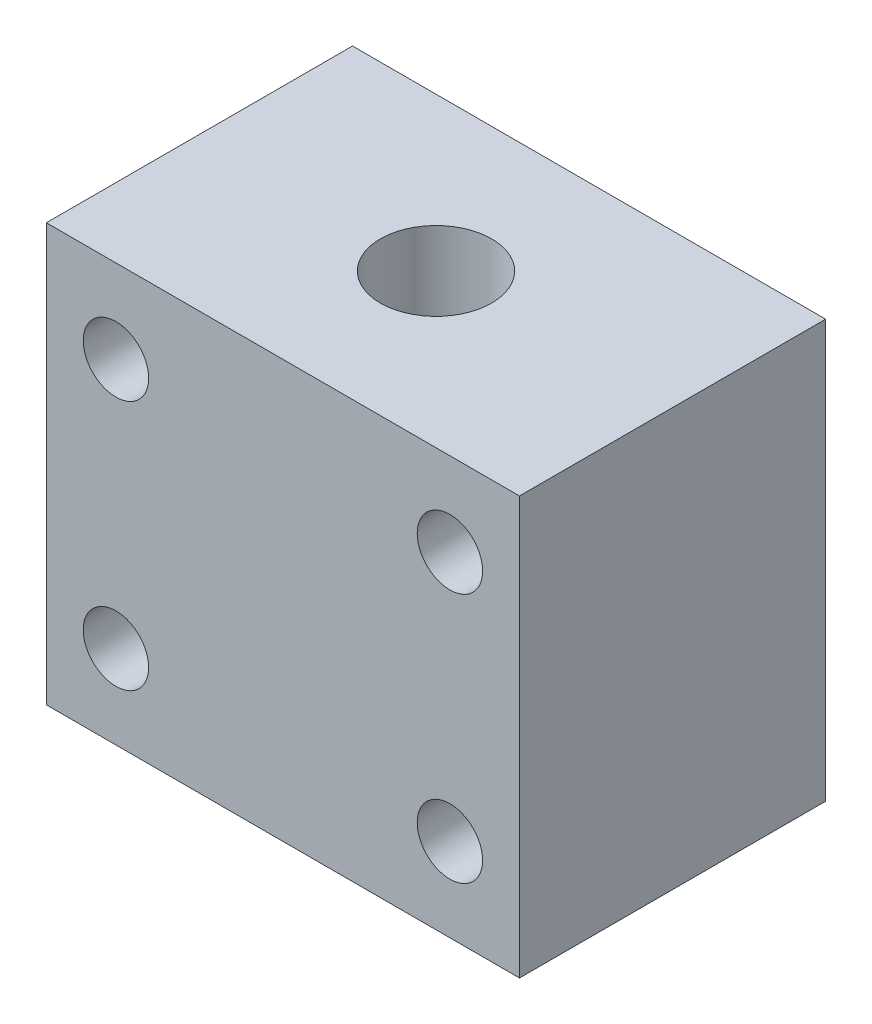
ISO-10303-21;
HEADER;
FILE_DESCRIPTION(('STEP AP214'),'2;1');
FILE_NAME('part.step','',(''),(''),'','','');
FILE_SCHEMA(('AUTOMOTIVE_DESIGN { 1 0 10303 214 1 1 1 1 }'));
ENDSEC;
DATA;
#1=APPLICATION_CONTEXT('core data for automotive mechanical design processes');
#2=APPLICATION_PROTOCOL_DEFINITION('international standard','automotive_design',2000,#1);
#3=PRODUCT_CONTEXT('',#1,'mechanical');
#4=PRODUCT('Part','Part','',(#3));
#5=PRODUCT_RELATED_PRODUCT_CATEGORY('part','',(#4));
#6=PRODUCT_DEFINITION_FORMATION('','',#4);
#7=PRODUCT_DEFINITION_CONTEXT('part definition',#1,'design');
#8=PRODUCT_DEFINITION('design','',#6,#7);
#9=PRODUCT_DEFINITION_SHAPE('','',#8);
#10=(LENGTH_UNIT() NAMED_UNIT(*) SI_UNIT(.MILLI.,.METRE.));
#11=(NAMED_UNIT(*) PLANE_ANGLE_UNIT() SI_UNIT($,.RADIAN.));
#12=(NAMED_UNIT(*) SI_UNIT($,.STERADIAN.) SOLID_ANGLE_UNIT());
#13=UNCERTAINTY_MEASURE_WITH_UNIT(LENGTH_MEASURE(1.E-05),#10,'distance_accuracy_value','');
#14=(GEOMETRIC_REPRESENTATION_CONTEXT(3) GLOBAL_UNCERTAINTY_ASSIGNED_CONTEXT((#13)) GLOBAL_UNIT_ASSIGNED_CONTEXT((#10,
#11,#12)) REPRESENTATION_CONTEXT('',''));
#15=CARTESIAN_POINT('',(0.,0.,0.));
#16=DIRECTION('',(0.,0.,1.));
#17=DIRECTION('',(1.,0.,0.));
#18=AXIS2_PLACEMENT_3D('',#15,#16,#17);
#19=CARTESIAN_POINT('',(0.,30.,0.));
#20=DIRECTION('',(0.,1.,0.));
#21=DIRECTION('',(0.,0.,1.));
#22=AXIS2_PLACEMENT_3D('',#19,#20,#21);
#23=PLANE('',#22);
#24=DIRECTION('',(0.,0.,-1.));
#25=VECTOR('',#24,1.);
#26=CARTESIAN_POINT('',(17.,30.,-11.));
#27=LINE('',#26,#25);
#28=CARTESIAN_POINT('',(17.,30.,11.));
#29=VERTEX_POINT('',#28);
#30=CARTESIAN_POINT('',(17.,30.,-11.));
#31=VERTEX_POINT('',#30);
#32=EDGE_CURVE('E96',#29,#31,#27,.T.);
#33=ORIENTED_EDGE('',*,*,#32,.T.);
#34=DIRECTION('',(-1.,0.,0.));
#35=VECTOR('',#34,1.);
#36=CARTESIAN_POINT('',(-17.,30.,-11.));
#37=LINE('',#36,#35);
#38=CARTESIAN_POINT('',(-17.,30.,-11.));
#39=VERTEX_POINT('',#38);
#40=EDGE_CURVE('E91',#31,#39,#37,.T.);
#41=ORIENTED_EDGE('',*,*,#40,.T.);
#42=DIRECTION('',(0.,0.,1.));
#43=VECTOR('',#42,1.);
#44=CARTESIAN_POINT('',(-17.,30.,-11.));
#45=LINE('',#44,#43);
#46=CARTESIAN_POINT('',(-17.,30.,11.));
#47=VERTEX_POINT('',#46);
#48=EDGE_CURVE('E94',#39,#47,#45,.T.);
#49=ORIENTED_EDGE('',*,*,#48,.T.);
#50=DIRECTION('',(1.,0.,0.));
#51=VECTOR('',#50,1.);
#52=CARTESIAN_POINT('',(-17.,30.,11.));
#53=LINE('',#52,#51);
#54=EDGE_CURVE('E61',#47,#29,#53,.T.);
#55=ORIENTED_EDGE('',*,*,#54,.T.);
#56=EDGE_LOOP('',(#33,#41,#49,#55));
#57=FACE_BOUND('',#56,.T.);
#58=CARTESIAN_POINT('',(0.,30.,0.));
#59=DIRECTION('',(0.,1.,0.));
#60=DIRECTION('',(0.,0.,1.));
#61=AXIS2_PLACEMENT_3D('',#58,#59,#60);
#62=CIRCLE('',#61,4.);
#63=CARTESIAN_POINT('',(0.,30.,3.99999999999997));
#64=VERTEX_POINT('',#63);
#65=EDGE_CURVE('E116',#64,#64,#62,.T.);
#66=ORIENTED_EDGE('',*,*,#65,.F.);
#67=EDGE_LOOP('',(#66));
#68=FACE_BOUND('',#67,.T.);
#69=ADVANCED_FACE('F43',(#57,#68),#23,.T.);
#70=CARTESIAN_POINT('',(0.,0.,0.));
#71=DIRECTION('',(0.,1.,0.));
#72=DIRECTION('',(0.,0.,1.));
#73=AXIS2_PLACEMENT_3D('',#70,#71,#72);
#74=PLANE('',#73);
#75=DIRECTION('',(0.,0.,-1.));
#76=VECTOR('',#75,1.);
#77=CARTESIAN_POINT('',(17.,0.,-11.));
#78=LINE('',#77,#76);
#79=CARTESIAN_POINT('',(17.,0.,11.));
#80=VERTEX_POINT('',#79);
#81=CARTESIAN_POINT('',(17.,0.,-11.));
#82=VERTEX_POINT('',#81);
#83=EDGE_CURVE('E112',#80,#82,#78,.T.);
#84=ORIENTED_EDGE('',*,*,#83,.F.);
#85=DIRECTION('',(1.,0.,0.));
#86=VECTOR('',#85,1.);
#87=CARTESIAN_POINT('',(-17.,0.,11.));
#88=LINE('',#87,#86);
#89=CARTESIAN_POINT('',(-17.,0.,11.));
#90=VERTEX_POINT('',#89);
#91=EDGE_CURVE('E84',#90,#80,#88,.T.);
#92=ORIENTED_EDGE('',*,*,#91,.F.);
#93=DIRECTION('',(0.,0.,1.));
#94=VECTOR('',#93,1.);
#95=CARTESIAN_POINT('',(-17.,0.,-11.));
#96=LINE('',#95,#94);
#97=CARTESIAN_POINT('',(-17.,0.,-11.));
#98=VERTEX_POINT('',#97);
#99=EDGE_CURVE('E78',#98,#90,#96,.T.);
#100=ORIENTED_EDGE('',*,*,#99,.F.);
#101=DIRECTION('',(-1.,0.,0.));
#102=VECTOR('',#101,1.);
#103=CARTESIAN_POINT('',(-17.,0.,-11.));
#104=LINE('',#103,#102);
#105=EDGE_CURVE('E101',#82,#98,#104,.T.);
#106=ORIENTED_EDGE('',*,*,#105,.F.);
#107=EDGE_LOOP('',(#84,#92,#100,#106));
#108=FACE_BOUND('',#107,.T.);
#109=CARTESIAN_POINT('',(0.,0.,0.));
#110=DIRECTION('',(0.,1.,0.));
#111=DIRECTION('',(0.,0.,1.));
#112=AXIS2_PLACEMENT_3D('',#109,#110,#111);
#113=CIRCLE('',#112,4.);
#114=CARTESIAN_POINT('',(0.,0.,3.99999999999997));
#115=VERTEX_POINT('',#114);
#116=EDGE_CURVE('E134',#115,#115,#113,.T.);
#117=ORIENTED_EDGE('',*,*,#116,.T.);
#118=EDGE_LOOP('',(#117));
#119=FACE_BOUND('',#118,.T.);
#120=ADVANCED_FACE('F129',(#108,#119),#74,.F.);
#121=CARTESIAN_POINT('',(17.,30.,-11.));
#122=DIRECTION('',(-1.,0.,0.));
#123=DIRECTION('',(0.,0.,1.));
#124=AXIS2_PLACEMENT_3D('',#121,#122,#123);
#125=PLANE('',#124);
#126=ORIENTED_EDGE('',*,*,#83,.T.);
#127=DIRECTION('',(0.,-1.,0.));
#128=VECTOR('',#127,1.);
#129=CARTESIAN_POINT('',(17.,30.,-11.));
#130=LINE('',#129,#128);
#131=EDGE_CURVE('E11',#31,#82,#130,.T.);
#132=ORIENTED_EDGE('',*,*,#131,.F.);
#133=ORIENTED_EDGE('',*,*,#32,.F.);
#134=DIRECTION('',(0.,-1.,0.));
#135=VECTOR('',#134,1.);
#136=CARTESIAN_POINT('',(17.,30.,11.));
#137=LINE('',#136,#135);
#138=EDGE_CURVE('E108',#29,#80,#137,.T.);
#139=ORIENTED_EDGE('',*,*,#138,.T.);
#140=EDGE_LOOP('',(#126,#132,#133,#139));
#141=FACE_BOUND('',#140,.T.);
#142=ADVANCED_FACE('F45',(#141),#125,.F.);
#143=CARTESIAN_POINT('',(-17.,30.,-11.));
#144=DIRECTION('',(0.,0.,1.));
#145=DIRECTION('',(1.,0.,0.));
#146=AXIS2_PLACEMENT_3D('',#143,#144,#145);
#147=PLANE('',#146);
#148=ORIENTED_EDGE('',*,*,#105,.T.);
#149=DIRECTION('',(0.,-1.,0.));
#150=VECTOR('',#149,1.);
#151=CARTESIAN_POINT('',(-17.,30.,-11.));
#152=LINE('',#151,#150);
#153=EDGE_CURVE('E53',#39,#98,#152,.T.);
#154=ORIENTED_EDGE('',*,*,#153,.F.);
#155=ORIENTED_EDGE('',*,*,#40,.F.);
#156=ORIENTED_EDGE('',*,*,#131,.T.);
#157=EDGE_LOOP('',(#148,#154,#155,#156));
#158=FACE_BOUND('',#157,.T.);
#159=ADVANCED_FACE('F100',(#158),#147,.F.);
#160=CARTESIAN_POINT('',(-17.,30.,-11.));
#161=DIRECTION('',(1.,0.,0.));
#162=DIRECTION('',(0.,0.,-1.));
#163=AXIS2_PLACEMENT_3D('',#160,#161,#162);
#164=PLANE('',#163);
#165=ORIENTED_EDGE('',*,*,#99,.T.);
#166=DIRECTION('',(0.,-1.,0.));
#167=VECTOR('',#166,1.);
#168=CARTESIAN_POINT('',(-17.,30.,11.));
#169=LINE('',#168,#167);
#170=EDGE_CURVE('E103',#47,#90,#169,.T.);
#171=ORIENTED_EDGE('',*,*,#170,.F.);
#172=ORIENTED_EDGE('',*,*,#48,.F.);
#173=ORIENTED_EDGE('',*,*,#153,.T.);
#174=EDGE_LOOP('',(#165,#171,#172,#173));
#175=FACE_BOUND('',#174,.T.);
#176=ADVANCED_FACE('F104',(#175),#164,.F.);
#177=CARTESIAN_POINT('',(-17.,30.,11.));
#178=DIRECTION('',(0.,0.,-1.));
#179=DIRECTION('',(-1.,0.,0.));
#180=AXIS2_PLACEMENT_3D('',#177,#178,#179);
#181=PLANE('',#180);
#182=CARTESIAN_POINT('',(12.,24.,11.));
#183=DIRECTION('',(0.,0.,1.));
#184=DIRECTION('',(-1.,0.,0.));
#185=AXIS2_PLACEMENT_3D('',#182,#183,#184);
#186=CIRCLE('',#185,2.35);
#187=CARTESIAN_POINT('',(9.65000000000001,24.,11.));
#188=VERTEX_POINT('',#187);
#189=EDGE_CURVE('E154',#188,#188,#186,.T.);
#190=ORIENTED_EDGE('',*,*,#189,.F.);
#191=EDGE_LOOP('',(#190));
#192=FACE_BOUND('',#191,.T.);
#193=CARTESIAN_POINT('',(12.,5.99999999999999,11.));
#194=DIRECTION('',(0.,0.,1.));
#195=DIRECTION('',(-1.,0.,0.));
#196=AXIS2_PLACEMENT_3D('',#193,#194,#195);
#197=CIRCLE('',#196,2.35);
#198=CARTESIAN_POINT('',(9.65,5.99999999999999,11.));
#199=VERTEX_POINT('',#198);
#200=EDGE_CURVE('E162',#199,#199,#197,.T.);
#201=ORIENTED_EDGE('',*,*,#200,.F.);
#202=EDGE_LOOP('',(#201));
#203=FACE_BOUND('',#202,.T.);
#204=CARTESIAN_POINT('',(-12.,6.,11.));
#205=DIRECTION('',(0.,0.,1.));
#206=DIRECTION('',(1.,0.,0.));
#207=AXIS2_PLACEMENT_3D('',#204,#205,#206);
#208=CIRCLE('',#207,2.35);
#209=CARTESIAN_POINT('',(-9.65,6.,11.));
#210=VERTEX_POINT('',#209);
#211=EDGE_CURVE('E146',#210,#210,#208,.T.);
#212=ORIENTED_EDGE('',*,*,#211,.F.);
#213=EDGE_LOOP('',(#212));
#214=FACE_BOUND('',#213,.T.);
#215=CARTESIAN_POINT('',(-12.,24.,11.));
#216=DIRECTION('',(0.,0.,1.));
#217=DIRECTION('',(1.,0.,0.));
#218=AXIS2_PLACEMENT_3D('',#215,#216,#217);
#219=CIRCLE('',#218,2.35);
#220=CARTESIAN_POINT('',(-9.65,24.,11.));
#221=VERTEX_POINT('',#220);
#222=EDGE_CURVE('E142',#221,#221,#219,.T.);
#223=ORIENTED_EDGE('',*,*,#222,.F.);
#224=EDGE_LOOP('',(#223));
#225=FACE_BOUND('',#224,.T.);
#226=ORIENTED_EDGE('',*,*,#91,.T.);
#227=ORIENTED_EDGE('',*,*,#138,.F.);
#228=ORIENTED_EDGE('',*,*,#54,.F.);
#229=ORIENTED_EDGE('',*,*,#170,.T.);
#230=EDGE_LOOP('',(#226,#227,#228,#229));
#231=FACE_BOUND('',#230,.T.);
#232=ADVANCED_FACE('F126',(#192,#203,#214,#225,#231),#181,.F.);
#233=CARTESIAN_POINT('',(0.,30.,0.));
#234=DIRECTION('',(0.,-1.,0.));
#235=DIRECTION('',(0.,0.,-1.));
#236=AXIS2_PLACEMENT_3D('',#233,#234,#235);
#237=CYLINDRICAL_SURFACE('',#236,4.);
#238=ORIENTED_EDGE('',*,*,#65,.T.);
#239=EDGE_LOOP('',(#238));
#240=FACE_BOUND('',#239,.T.);
#241=ORIENTED_EDGE('',*,*,#116,.F.);
#242=EDGE_LOOP('',(#241));
#243=FACE_BOUND('',#242,.T.);
#244=ADVANCED_FACE('F178',(#240,#243),#237,.F.);
#245=CARTESIAN_POINT('',(-12.,24.,5.99999999999999));
#246=DIRECTION('',(0.,0.,1.));
#247=DIRECTION('',(1.,0.,0.));
#248=AXIS2_PLACEMENT_3D('',#245,#246,#247);
#249=CYLINDRICAL_SURFACE('',#248,2.35);
#250=CARTESIAN_POINT('',(-12.,24.,5.99999999999999));
#251=DIRECTION('',(0.,0.,1.));
#252=DIRECTION('',(1.,0.,0.));
#253=AXIS2_PLACEMENT_3D('',#250,#251,#252);
#254=CIRCLE('',#253,2.35);
#255=CARTESIAN_POINT('',(-9.65,24.,5.99999999999999));
#256=VERTEX_POINT('',#255);
#257=EDGE_CURVE('E138',#256,#256,#254,.T.);
#258=ORIENTED_EDGE('',*,*,#257,.F.);
#259=EDGE_LOOP('',(#258));
#260=FACE_BOUND('',#259,.T.);
#261=ORIENTED_EDGE('',*,*,#222,.T.);
#262=EDGE_LOOP('',(#261));
#263=FACE_BOUND('',#262,.T.);
#264=ADVANCED_FACE('F183',(#260,#263),#249,.F.);
#265=CARTESIAN_POINT('',(-12.,24.,5.99999999999999));
#266=DIRECTION('',(0.,0.,1.));
#267=DIRECTION('',(1.,0.,0.));
#268=AXIS2_PLACEMENT_3D('',#265,#266,#267);
#269=PLANE('',#268);
#270=ORIENTED_EDGE('',*,*,#257,.T.);
#271=EDGE_LOOP('',(#270));
#272=FACE_BOUND('',#271,.T.);
#273=ADVANCED_FACE('F185',(#272),#269,.T.);
#274=CARTESIAN_POINT('',(-12.,6.,5.99999999999999));
#275=DIRECTION('',(0.,0.,1.));
#276=DIRECTION('',(1.,0.,0.));
#277=AXIS2_PLACEMENT_3D('',#274,#275,#276);
#278=CYLINDRICAL_SURFACE('',#277,2.35);
#279=CARTESIAN_POINT('',(-12.,6.,5.99999999999999));
#280=DIRECTION('',(0.,0.,1.));
#281=DIRECTION('',(1.,0.,0.));
#282=AXIS2_PLACEMENT_3D('',#279,#280,#281);
#283=CIRCLE('',#282,2.35);
#284=CARTESIAN_POINT('',(-9.65,6.,5.99999999999999));
#285=VERTEX_POINT('',#284);
#286=EDGE_CURVE('E166',#285,#285,#283,.T.);
#287=ORIENTED_EDGE('',*,*,#286,.F.);
#288=EDGE_LOOP('',(#287));
#289=FACE_BOUND('',#288,.T.);
#290=ORIENTED_EDGE('',*,*,#211,.T.);
#291=EDGE_LOOP('',(#290));
#292=FACE_BOUND('',#291,.T.);
#293=ADVANCED_FACE('F174',(#289,#292),#278,.F.);
#294=CARTESIAN_POINT('',(-12.,6.,5.99999999999999));
#295=DIRECTION('',(0.,0.,1.));
#296=DIRECTION('',(1.,0.,0.));
#297=AXIS2_PLACEMENT_3D('',#294,#295,#296);
#298=PLANE('',#297);
#299=ORIENTED_EDGE('',*,*,#286,.T.);
#300=EDGE_LOOP('',(#299));
#301=FACE_BOUND('',#300,.T.);
#302=ADVANCED_FACE('F270',(#301),#298,.T.);
#303=CARTESIAN_POINT('',(12.,5.99999999999999,5.99999999999999));
#304=DIRECTION('',(0.,0.,1.));
#305=DIRECTION('',(1.,0.,0.));
#306=AXIS2_PLACEMENT_3D('',#303,#304,#305);
#307=CYLINDRICAL_SURFACE('',#306,2.35);
#308=CARTESIAN_POINT('',(12.,5.99999999999999,5.99999999999999));
#309=DIRECTION('',(0.,0.,1.));
#310=DIRECTION('',(-1.,0.,0.));
#311=AXIS2_PLACEMENT_3D('',#308,#309,#310);
#312=CIRCLE('',#311,2.35);
#313=CARTESIAN_POINT('',(9.65,5.99999999999999,5.99999999999999));
#314=VERTEX_POINT('',#313);
#315=EDGE_CURVE('E158',#314,#314,#312,.T.);
#316=ORIENTED_EDGE('',*,*,#315,.F.);
#317=EDGE_LOOP('',(#316));
#318=FACE_BOUND('',#317,.T.);
#319=ORIENTED_EDGE('',*,*,#200,.T.);
#320=EDGE_LOOP('',(#319));
#321=FACE_BOUND('',#320,.T.);
#322=ADVANCED_FACE('F280',(#318,#321),#307,.F.);
#323=CARTESIAN_POINT('',(12.,5.99999999999999,5.99999999999999));
#324=DIRECTION('',(0.,0.,-1.));
#325=DIRECTION('',(-1.,0.,0.));
#326=AXIS2_PLACEMENT_3D('',#323,#324,#325);
#327=PLANE('',#326);
#328=ORIENTED_EDGE('',*,*,#315,.T.);
#329=EDGE_LOOP('',(#328));
#330=FACE_BOUND('',#329,.T.);
#331=ADVANCED_FACE('F290',(#330),#327,.F.);
#332=CARTESIAN_POINT('',(12.,24.,5.99999999999999));
#333=DIRECTION('',(0.,0.,1.));
#334=DIRECTION('',(1.,0.,0.));
#335=AXIS2_PLACEMENT_3D('',#332,#333,#334);
#336=CYLINDRICAL_SURFACE('',#335,2.35);
#337=CARTESIAN_POINT('',(12.,24.,5.99999999999999));
#338=DIRECTION('',(0.,0.,1.));
#339=DIRECTION('',(-1.,0.,0.));
#340=AXIS2_PLACEMENT_3D('',#337,#338,#339);
#341=CIRCLE('',#340,2.35);
#342=CARTESIAN_POINT('',(9.65000000000001,24.,5.99999999999999));
#343=VERTEX_POINT('',#342);
#344=EDGE_CURVE('E150',#343,#343,#341,.T.);
#345=ORIENTED_EDGE('',*,*,#344,.F.);
#346=EDGE_LOOP('',(#345));
#347=FACE_BOUND('',#346,.T.);
#348=ORIENTED_EDGE('',*,*,#189,.T.);
#349=EDGE_LOOP('',(#348));
#350=FACE_BOUND('',#349,.T.);
#351=ADVANCED_FACE('F300',(#347,#350),#336,.F.);
#352=CARTESIAN_POINT('',(12.,24.,5.99999999999999));
#353=DIRECTION('',(0.,0.,-1.));
#354=DIRECTION('',(-1.,0.,0.));
#355=AXIS2_PLACEMENT_3D('',#352,#353,#354);
#356=PLANE('',#355);
#357=ORIENTED_EDGE('',*,*,#344,.T.);
#358=EDGE_LOOP('',(#357));
#359=FACE_BOUND('',#358,.T.);
#360=ADVANCED_FACE('F310',(#359),#356,.F.);
#361=CLOSED_SHELL('',(#69,#120,#142,#159,#176,#232,#244,#264,#273,#293,#302,#322,#331,#351,#360));
#362=MANIFOLD_SOLID_BREP('B2',#361);
#363=ADVANCED_BREP_SHAPE_REPRESENTATION('',(#18,#362),#14);
#364=SHAPE_DEFINITION_REPRESENTATION(#9,#363);
ENDSEC;
END-ISO-10303-21;
